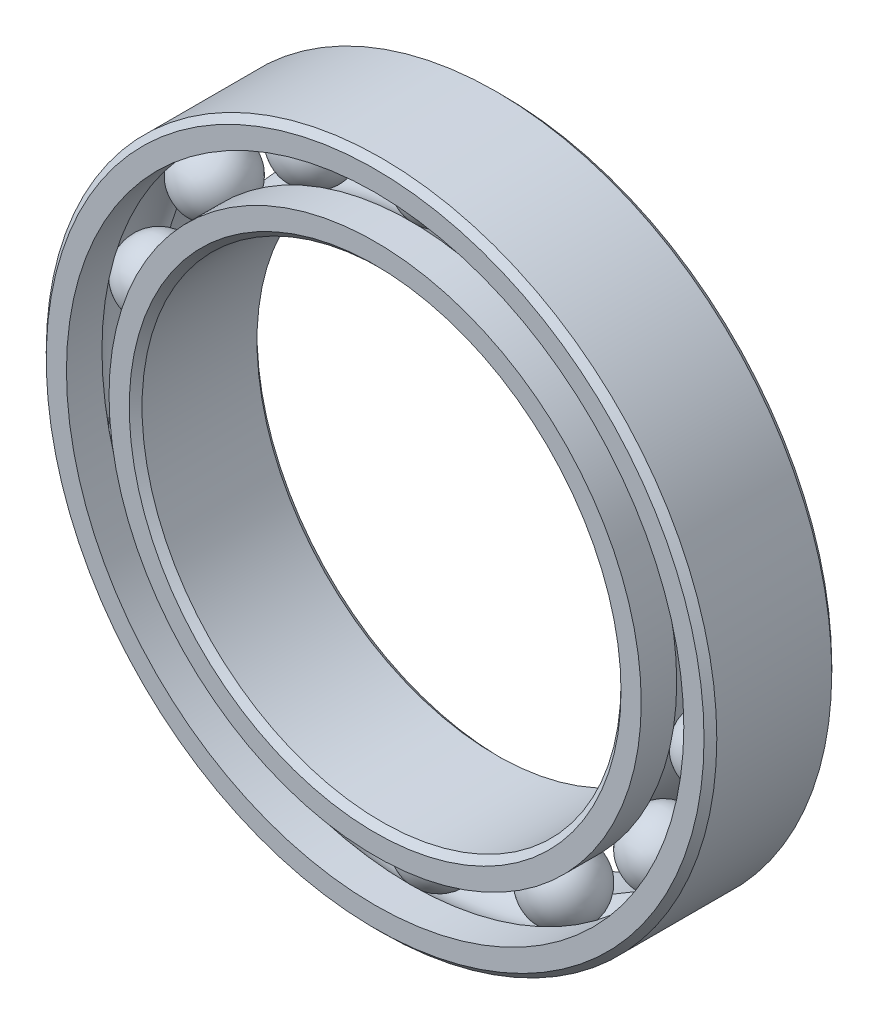
ISO-10303-21;
HEADER;
FILE_DESCRIPTION(('STEP AP214'),'2;1');
FILE_NAME('part.step','',(''),(''),'','','');
FILE_SCHEMA(('AUTOMOTIVE_DESIGN { 1 0 10303 214 1 1 1 1 }'));
ENDSEC;
DATA;
#1=APPLICATION_CONTEXT('core data for automotive mechanical design processes');
#2=APPLICATION_PROTOCOL_DEFINITION('international standard','automotive_design',2000,#1);
#3=PRODUCT_CONTEXT('',#1,'mechanical');
#4=PRODUCT('Part','Part','',(#3));
#5=PRODUCT_RELATED_PRODUCT_CATEGORY('part','',(#4));
#6=PRODUCT_DEFINITION_FORMATION('','',#4);
#7=PRODUCT_DEFINITION_CONTEXT('part definition',#1,'design');
#8=PRODUCT_DEFINITION('design','',#6,#7);
#9=PRODUCT_DEFINITION_SHAPE('','',#8);
#10=(LENGTH_UNIT() NAMED_UNIT(*) SI_UNIT(.MILLI.,.METRE.));
#11=(NAMED_UNIT(*) PLANE_ANGLE_UNIT() SI_UNIT($,.RADIAN.));
#12=(NAMED_UNIT(*) SI_UNIT($,.STERADIAN.) SOLID_ANGLE_UNIT());
#13=UNCERTAINTY_MEASURE_WITH_UNIT(LENGTH_MEASURE(1.E-05),#10,'distance_accuracy_value','');
#14=(GEOMETRIC_REPRESENTATION_CONTEXT(3) GLOBAL_UNCERTAINTY_ASSIGNED_CONTEXT((#13)) GLOBAL_UNIT_ASSIGNED_CONTEXT((#10,
#11,#12)) REPRESENTATION_CONTEXT('',''));
#15=CARTESIAN_POINT('',(0.,0.,0.));
#16=DIRECTION('',(0.,0.,1.));
#17=DIRECTION('',(1.,0.,0.));
#18=AXIS2_PLACEMENT_3D('',#15,#16,#17);
#19=CARTESIAN_POINT('',(3.90495365205792,8.10871981112182,0.));
#20=DIRECTION('',(0.,0.,1.));
#21=DIRECTION('',(0.433883739117546,0.900968867902425,0.));
#22=AXIS2_PLACEMENT_3D('',#19,#20,#21);
#23=SPHERICAL_SURFACE('',#22,1.11111111111111);
#24=CARTESIAN_POINT('',(3.90495365205792,8.10871981112182,1.11111111111111));
#25=VERTEX_POINT('',#24);
#26=VERTEX_LOOP('',#25);
#27=FACE_BOUND('',#26,.T.);
#28=ADVANCED_FACE('F37',(#27),#23,.T.);
#29=CLOSED_SHELL('',(#28));
#30=MANIFOLD_SOLID_BREP('B2',#29);
#31=CARTESIAN_POINT('',(7.0364833422122,5.61140821672869,0.));
#32=DIRECTION('',(0.,0.,1.));
#33=DIRECTION('',(0.781831482468022,0.623489801858743,0.));
#34=AXIS2_PLACEMENT_3D('',#31,#32,#33);
#35=SPHERICAL_SURFACE('',#34,1.11111111111111);
#36=CARTESIAN_POINT('',(7.0364833422122,5.61140821672869,1.11111111111111));
#37=VERTEX_POINT('',#36);
#38=VERTEX_LOOP('',#37);
#39=FACE_BOUND('',#38,.T.);
#40=ADVANCED_FACE('F57',(#39),#35,.T.);
#41=CLOSED_SHELL('',(#40));
#42=MANIFOLD_SOLID_BREP('B6',#41);
#43=CARTESIAN_POINT('',(8.77435120963639,2.00268840560692,0.));
#44=DIRECTION('',(0.,0.,1.));
#45=DIRECTION('',(0.974927912181821,0.222520933956325,0.));
#46=AXIS2_PLACEMENT_3D('',#43,#44,#45);
#47=SPHERICAL_SURFACE('',#46,1.11111111111111);
#48=CARTESIAN_POINT('',(8.77435120963639,2.00268840560692,1.11111111111111));
#49=VERTEX_POINT('',#48);
#50=VERTEX_LOOP('',#49);
#51=FACE_BOUND('',#50,.T.);
#52=ADVANCED_FACE('F77',(#51),#47,.T.);
#53=CLOSED_SHELL('',(#52));
#54=MANIFOLD_SOLID_BREP('B33',#53);
#55=CARTESIAN_POINT('',(8.77435120963643,-2.00268840560675,0.));
#56=DIRECTION('',(0.,0.,1.));
#57=DIRECTION('',(0.974927912181826,-0.222520933956305,0.));
#58=AXIS2_PLACEMENT_3D('',#55,#56,#57);
#59=SPHERICAL_SURFACE('',#58,1.11111111111111);
#60=CARTESIAN_POINT('',(8.77435120963643,-2.00268840560675,1.11111111111111));
#61=VERTEX_POINT('',#60);
#62=VERTEX_LOOP('',#61);
#63=FACE_BOUND('',#62,.T.);
#64=ADVANCED_FACE('F97',(#63),#59,.T.);
#65=CLOSED_SHELL('',(#64));
#66=MANIFOLD_SOLID_BREP('B53',#65);
#67=CARTESIAN_POINT('',(7.03648334221232,-5.61140821672854,0.));
#68=DIRECTION('',(0.,0.,1.));
#69=DIRECTION('',(0.781831482468035,-0.623489801858727,0.));
#70=AXIS2_PLACEMENT_3D('',#67,#68,#69);
#71=SPHERICAL_SURFACE('',#70,1.11111111111111);
#72=CARTESIAN_POINT('',(7.03648334221232,-5.61140821672854,1.11111111111111));
#73=VERTEX_POINT('',#72);
#74=VERTEX_LOOP('',#73);
#75=FACE_BOUND('',#74,.T.);
#76=ADVANCED_FACE('F117',(#75),#71,.T.);
#77=CLOSED_SHELL('',(#76));
#78=MANIFOLD_SOLID_BREP('B73',#77);
#79=CARTESIAN_POINT('',(3.90495365205809,-8.10871981112174,0.));
#80=DIRECTION('',(0.,0.,1.));
#81=DIRECTION('',(0.433883739117565,-0.900968867902416,0.));
#82=AXIS2_PLACEMENT_3D('',#79,#80,#81);
#83=SPHERICAL_SURFACE('',#82,1.11111111111111);
#84=CARTESIAN_POINT('',(3.90495365205809,-8.10871981112174,1.11111111111111));
#85=VERTEX_POINT('',#84);
#86=VERTEX_LOOP('',#85);
#87=FACE_BOUND('',#86,.T.);
#88=ADVANCED_FACE('F137',(#87),#83,.T.);
#89=CLOSED_SHELL('',(#88));
#90=MANIFOLD_SOLID_BREP('B93',#89);
#91=CARTESIAN_POINT('',(0.,-9.,0.));
#92=DIRECTION('',(0.,0.,1.));
#93=DIRECTION('',(0.,-1.,0.));
#94=AXIS2_PLACEMENT_3D('',#91,#92,#93);
#95=SPHERICAL_SURFACE('',#94,1.11111111111111);
#96=CARTESIAN_POINT('',(0.,-9.,1.11111111111111));
#97=VERTEX_POINT('',#96);
#98=VERTEX_LOOP('',#97);
#99=FACE_BOUND('',#98,.T.);
#100=ADVANCED_FACE('F157',(#99),#95,.T.);
#101=CLOSED_SHELL('',(#100));
#102=MANIFOLD_SOLID_BREP('B113',#101);
#103=CARTESIAN_POINT('',(-3.90495365205797,-8.1087198111218,0.));
#104=DIRECTION('',(0.,0.,1.));
#105=DIRECTION('',(-0.433883739117553,-0.900968867902422,0.));
#106=AXIS2_PLACEMENT_3D('',#103,#104,#105);
#107=SPHERICAL_SURFACE('',#106,1.11111111111111);
#108=CARTESIAN_POINT('',(-3.90495365205797,-8.1087198111218,1.11111111111111));
#109=VERTEX_POINT('',#108);
#110=VERTEX_LOOP('',#109);
#111=FACE_BOUND('',#110,.T.);
#112=ADVANCED_FACE('F177',(#111),#107,.T.);
#113=CLOSED_SHELL('',(#112));
#114=MANIFOLD_SOLID_BREP('B133',#113);
#115=CARTESIAN_POINT('',(-7.03648334221224,-5.61140821672864,0.));
#116=DIRECTION('',(0.,0.,1.));
#117=DIRECTION('',(-0.781831482468027,-0.623489801858737,0.));
#118=AXIS2_PLACEMENT_3D('',#115,#116,#117);
#119=SPHERICAL_SURFACE('',#118,1.11111111111111);
#120=CARTESIAN_POINT('',(-7.03648334221224,-5.61140821672864,1.11111111111111));
#121=VERTEX_POINT('',#120);
#122=VERTEX_LOOP('',#121);
#123=FACE_BOUND('',#122,.T.);
#124=ADVANCED_FACE('F197',(#123),#119,.T.);
#125=CLOSED_SHELL('',(#124));
#126=MANIFOLD_SOLID_BREP('B153',#125);
#127=CARTESIAN_POINT('',(-8.77435120963641,-2.00268840560686,0.));
#128=DIRECTION('',(0.,0.,1.));
#129=DIRECTION('',(-0.974927912181823,-0.222520933956318,0.));
#130=AXIS2_PLACEMENT_3D('',#127,#128,#129);
#131=SPHERICAL_SURFACE('',#130,1.11111111111111);
#132=CARTESIAN_POINT('',(-8.77435120963641,-2.00268840560686,1.11111111111111));
#133=VERTEX_POINT('',#132);
#134=VERTEX_LOOP('',#133);
#135=FACE_BOUND('',#134,.T.);
#136=ADVANCED_FACE('F217',(#135),#131,.T.);
#137=CLOSED_SHELL('',(#136));
#138=MANIFOLD_SOLID_BREP('B173',#137);
#139=CARTESIAN_POINT('',(-8.77435120963642,2.0026884056068,0.));
#140=DIRECTION('',(0.,0.,1.));
#141=DIRECTION('',(-0.974927912181824,0.222520933956311,0.));
#142=AXIS2_PLACEMENT_3D('',#139,#140,#141);
#143=SPHERICAL_SURFACE('',#142,1.11111111111111);
#144=CARTESIAN_POINT('',(-8.77435120963642,2.0026884056068,1.11111111111111));
#145=VERTEX_POINT('',#144);
#146=VERTEX_LOOP('',#145);
#147=FACE_BOUND('',#146,.T.);
#148=ADVANCED_FACE('F237',(#147),#143,.T.);
#149=CLOSED_SHELL('',(#148));
#150=MANIFOLD_SOLID_BREP('B193',#149);
#151=CARTESIAN_POINT('',(-7.03648334221228,5.61140821672859,0.));
#152=DIRECTION('',(0.,0.,1.));
#153=DIRECTION('',(-0.781831482468031,0.623489801858732,0.));
#154=AXIS2_PLACEMENT_3D('',#151,#152,#153);
#155=SPHERICAL_SURFACE('',#154,1.11111111111111);
#156=CARTESIAN_POINT('',(-7.03648334221228,5.61140821672859,1.11111111111111));
#157=VERTEX_POINT('',#156);
#158=VERTEX_LOOP('',#157);
#159=FACE_BOUND('',#158,.T.);
#160=ADVANCED_FACE('F257',(#159),#155,.T.);
#161=CLOSED_SHELL('',(#160));
#162=MANIFOLD_SOLID_BREP('B213',#161);
#163=CARTESIAN_POINT('',(-3.90495365205803,8.10871981112177,0.));
#164=DIRECTION('',(0.,0.,1.));
#165=DIRECTION('',(-0.433883739117559,0.900968867902419,0.));
#166=AXIS2_PLACEMENT_3D('',#163,#164,#165);
#167=SPHERICAL_SURFACE('',#166,1.11111111111111);
#168=CARTESIAN_POINT('',(-3.90495365205803,8.10871981112177,1.11111111111111));
#169=VERTEX_POINT('',#168);
#170=VERTEX_LOOP('',#169);
#171=FACE_BOUND('',#170,.T.);
#172=ADVANCED_FACE('F277',(#171),#167,.T.);
#173=CLOSED_SHELL('',(#172));
#174=MANIFOLD_SOLID_BREP('B233',#173);
#175=CARTESIAN_POINT('',(0.,9.,0.));
#176=DIRECTION('',(0.,0.,1.));
#177=DIRECTION('',(0.,1.,0.));
#178=AXIS2_PLACEMENT_3D('',#175,#176,#177);
#179=SPHERICAL_SURFACE('',#178,1.11111111111111);
#180=CARTESIAN_POINT('',(0.,9.,1.11111111111111));
#181=VERTEX_POINT('',#180);
#182=VERTEX_LOOP('',#181);
#183=FACE_BOUND('',#182,.T.);
#184=ADVANCED_FACE('F299',(#183),#179,.T.);
#185=CLOSED_SHELL('',(#184));
#186=MANIFOLD_SOLID_BREP('B253',#185);
#187=CARTESIAN_POINT('',(0.,8.33333333333333,2.));
#188=DIRECTION('',(0.,0.,-1.));
#189=DIRECTION('',(-1.,0.,0.));
#190=AXIS2_PLACEMENT_3D('',#187,#188,#189);
#191=PLANE('',#190);
#192=CARTESIAN_POINT('',(0.,0.,2.));
#193=DIRECTION('',(0.,0.,1.));
#194=DIRECTION('',(1.,0.,0.));
#195=AXIS2_PLACEMENT_3D('',#192,#193,#194);
#196=CIRCLE('',#195,7.7);
#197=CARTESIAN_POINT('',(7.7,0.,2.));
#198=VERTEX_POINT('',#197);
#199=EDGE_CURVE('E346',#198,#198,#196,.T.);
#200=ORIENTED_EDGE('',*,*,#199,.F.);
#201=EDGE_LOOP('',(#200));
#202=FACE_BOUND('',#201,.T.);
#203=CARTESIAN_POINT('',(0.,0.,2.));
#204=DIRECTION('',(0.,0.,1.));
#205=DIRECTION('',(1.,0.,0.));
#206=AXIS2_PLACEMENT_3D('',#203,#204,#205);
#207=CIRCLE('',#206,8.33333333333333);
#208=CARTESIAN_POINT('',(8.33333333333333,0.,2.));
#209=VERTEX_POINT('',#208);
#210=EDGE_CURVE('E298',#209,#209,#207,.T.);
#211=ORIENTED_EDGE('',*,*,#210,.T.);
#212=EDGE_LOOP('',(#211));
#213=FACE_BOUND('',#212,.T.);
#214=ADVANCED_FACE('F318',(#202,#213),#191,.F.);
#215=CARTESIAN_POINT('',(0.,0.,2.));
#216=DIRECTION('',(0.,0.,1.));
#217=DIRECTION('',(1.,0.,0.));
#218=AXIS2_PLACEMENT_3D('',#215,#216,#217);
#219=CYLINDRICAL_SURFACE('',#218,8.33333333333333);
#220=ORIENTED_EDGE('',*,*,#210,.F.);
#221=EDGE_LOOP('',(#220));
#222=FACE_BOUND('',#221,.T.);
#223=CARTESIAN_POINT('',(0.,0.,0.888888888888889));
#224=DIRECTION('',(0.,0.,1.));
#225=DIRECTION('',(1.,0.,0.));
#226=AXIS2_PLACEMENT_3D('',#223,#224,#225);
#227=CIRCLE('',#226,8.33333333333333);
#228=CARTESIAN_POINT('',(8.33333333333333,0.,0.888888888888889));
#229=VERTEX_POINT('',#228);
#230=EDGE_CURVE('E324',#229,#229,#227,.T.);
#231=ORIENTED_EDGE('',*,*,#230,.T.);
#232=EDGE_LOOP('',(#231));
#233=FACE_BOUND('',#232,.T.);
#234=ADVANCED_FACE('F353',(#222,#233),#219,.T.);
#235=CARTESIAN_POINT('',(0.,0.,0.));
#236=DIRECTION('',(0.,0.,1.));
#237=DIRECTION('',(1.,0.,0.));
#238=AXIS2_PLACEMENT_3D('',#235,#236,#237);
#239=TOROIDAL_SURFACE('',#238,9.,1.11111111111111);
#240=ORIENTED_EDGE('',*,*,#230,.F.);
#241=EDGE_LOOP('',(#240));
#242=FACE_BOUND('',#241,.T.);
#243=CARTESIAN_POINT('',(0.,0.,-0.888888888888889));
#244=DIRECTION('',(0.,0.,1.));
#245=DIRECTION('',(1.,0.,0.));
#246=AXIS2_PLACEMENT_3D('',#243,#244,#245);
#247=CIRCLE('',#246,8.33333333333333);
#248=CARTESIAN_POINT('',(8.33333333333333,0.,-0.888888888888889));
#249=VERTEX_POINT('',#248);
#250=EDGE_CURVE('E328',#249,#249,#247,.T.);
#251=ORIENTED_EDGE('',*,*,#250,.T.);
#252=EDGE_LOOP('',(#251));
#253=FACE_BOUND('',#252,.T.);
#254=ADVANCED_FACE('F357',(#242,#253),#239,.F.);
#255=CARTESIAN_POINT('',(0.,0.,2.));
#256=DIRECTION('',(0.,0.,1.));
#257=DIRECTION('',(1.,0.,0.));
#258=AXIS2_PLACEMENT_3D('',#255,#256,#257);
#259=CYLINDRICAL_SURFACE('',#258,8.33333333333333);
#260=ORIENTED_EDGE('',*,*,#250,.F.);
#261=EDGE_LOOP('',(#260));
#262=FACE_BOUND('',#261,.T.);
#263=CARTESIAN_POINT('',(0.,0.,-2.));
#264=DIRECTION('',(0.,0.,1.));
#265=DIRECTION('',(1.,0.,0.));
#266=AXIS2_PLACEMENT_3D('',#263,#264,#265);
#267=CIRCLE('',#266,8.33333333333333);
#268=CARTESIAN_POINT('',(8.33333333333333,0.,-2.));
#269=VERTEX_POINT('',#268);
#270=EDGE_CURVE('E332',#269,#269,#267,.T.);
#271=ORIENTED_EDGE('',*,*,#270,.T.);
#272=EDGE_LOOP('',(#271));
#273=FACE_BOUND('',#272,.T.);
#274=ADVANCED_FACE('F362',(#262,#273),#259,.T.);
#275=CARTESIAN_POINT('',(0.,7.7,-2.));
#276=DIRECTION('',(0.,0.,1.));
#277=DIRECTION('',(1.,0.,0.));
#278=AXIS2_PLACEMENT_3D('',#275,#276,#277);
#279=PLANE('',#278);
#280=ORIENTED_EDGE('',*,*,#270,.F.);
#281=EDGE_LOOP('',(#280));
#282=FACE_BOUND('',#281,.T.);
#283=CARTESIAN_POINT('',(0.,0.,-2.));
#284=DIRECTION('',(0.,0.,1.));
#285=DIRECTION('',(1.,0.,0.));
#286=AXIS2_PLACEMENT_3D('',#283,#284,#285);
#287=CIRCLE('',#286,7.7);
#288=CARTESIAN_POINT('',(7.7,0.,-2.));
#289=VERTEX_POINT('',#288);
#290=EDGE_CURVE('E337',#289,#289,#287,.T.);
#291=ORIENTED_EDGE('',*,*,#290,.T.);
#292=EDGE_LOOP('',(#291));
#293=FACE_BOUND('',#292,.T.);
#294=ADVANCED_FACE('F368',(#282,#293),#279,.F.);
#295=CARTESIAN_POINT('',(0.,0.,-1.8));
#296=DIRECTION('',(0.,0.,-1.));
#297=DIRECTION('',(-1.,0.,0.));
#298=AXIS2_PLACEMENT_3D('',#295,#296,#297);
#299=CONICAL_SURFACE('',#298,7.5,0.785398163397445);
#300=ORIENTED_EDGE('',*,*,#290,.F.);
#301=EDGE_LOOP('',(#300));
#302=FACE_BOUND('',#301,.T.);
#303=CARTESIAN_POINT('',(0.,0.,-1.8));
#304=DIRECTION('',(0.,0.,1.));
#305=DIRECTION('',(1.,0.,0.));
#306=AXIS2_PLACEMENT_3D('',#303,#304,#305);
#307=CIRCLE('',#306,7.5);
#308=CARTESIAN_POINT('',(7.5,0.,-1.8));
#309=VERTEX_POINT('',#308);
#310=EDGE_CURVE('E340',#309,#309,#307,.T.);
#311=ORIENTED_EDGE('',*,*,#310,.T.);
#312=EDGE_LOOP('',(#311));
#313=FACE_BOUND('',#312,.T.);
#314=ADVANCED_FACE('F372',(#302,#313),#299,.F.);
#315=CARTESIAN_POINT('',(0.,0.,2.));
#316=DIRECTION('',(0.,0.,1.));
#317=DIRECTION('',(1.,0.,0.));
#318=AXIS2_PLACEMENT_3D('',#315,#316,#317);
#319=CYLINDRICAL_SURFACE('',#318,7.5);
#320=ORIENTED_EDGE('',*,*,#310,.F.);
#321=EDGE_LOOP('',(#320));
#322=FACE_BOUND('',#321,.T.);
#323=CARTESIAN_POINT('',(0.,0.,1.8));
#324=DIRECTION('',(0.,0.,1.));
#325=DIRECTION('',(1.,0.,0.));
#326=AXIS2_PLACEMENT_3D('',#323,#324,#325);
#327=CIRCLE('',#326,7.5);
#328=CARTESIAN_POINT('',(7.5,0.,1.8));
#329=VERTEX_POINT('',#328);
#330=EDGE_CURVE('E343',#329,#329,#327,.T.);
#331=ORIENTED_EDGE('',*,*,#330,.T.);
#332=EDGE_LOOP('',(#331));
#333=FACE_BOUND('',#332,.T.);
#334=ADVANCED_FACE('F376',(#322,#333),#319,.F.);
#335=CARTESIAN_POINT('',(0.,0.,2.));
#336=DIRECTION('',(0.,0.,1.));
#337=DIRECTION('',(1.,0.,0.));
#338=AXIS2_PLACEMENT_3D('',#335,#336,#337);
#339=CONICAL_SURFACE('',#338,7.7,0.785398163397452);
#340=ORIENTED_EDGE('',*,*,#330,.F.);
#341=EDGE_LOOP('',(#340));
#342=FACE_BOUND('',#341,.T.);
#343=ORIENTED_EDGE('',*,*,#199,.T.);
#344=EDGE_LOOP('',(#343));
#345=FACE_BOUND('',#344,.T.);
#346=ADVANCED_FACE('F350',(#342,#345),#339,.F.);
#347=CLOSED_SHELL('',(#214,#234,#254,#274,#294,#314,#334,#346));
#348=MANIFOLD_SOLID_BREP('B273',#347);
#349=CARTESIAN_POINT('',(0.,0.,1.8));
#350=DIRECTION('',(0.,0.,-1.));
#351=DIRECTION('',(-1.,0.,0.));
#352=AXIS2_PLACEMENT_3D('',#349,#350,#351);
#353=CONICAL_SURFACE('',#352,10.5,0.785398163397442);
#354=CARTESIAN_POINT('',(0.,0.,2.));
#355=DIRECTION('',(0.,0.,1.));
#356=DIRECTION('',(1.,0.,0.));
#357=AXIS2_PLACEMENT_3D('',#354,#355,#356);
#358=CIRCLE('',#357,10.3);
#359=CARTESIAN_POINT('',(10.3,0.,2.));
#360=VERTEX_POINT('',#359);
#361=EDGE_CURVE('E467',#360,#360,#358,.T.);
#362=ORIENTED_EDGE('',*,*,#361,.F.);
#363=EDGE_LOOP('',(#362));
#364=FACE_BOUND('',#363,.T.);
#365=CARTESIAN_POINT('',(0.,0.,1.8));
#366=DIRECTION('',(0.,0.,1.));
#367=DIRECTION('',(1.,0.,0.));
#368=AXIS2_PLACEMENT_3D('',#365,#366,#367);
#369=CIRCLE('',#368,10.5);
#370=CARTESIAN_POINT('',(10.5,0.,1.8));
#371=VERTEX_POINT('',#370);
#372=EDGE_CURVE('E317',#371,#371,#369,.T.);
#373=ORIENTED_EDGE('',*,*,#372,.T.);
#374=EDGE_LOOP('',(#373));
#375=FACE_BOUND('',#374,.T.);
#376=ADVANCED_FACE('F439',(#364,#375),#353,.T.);
#377=CARTESIAN_POINT('',(0.,0.,2.));
#378=DIRECTION('',(0.,0.,1.));
#379=DIRECTION('',(1.,0.,0.));
#380=AXIS2_PLACEMENT_3D('',#377,#378,#379);
#381=CYLINDRICAL_SURFACE('',#380,10.5);
#382=ORIENTED_EDGE('',*,*,#372,.F.);
#383=EDGE_LOOP('',(#382));
#384=FACE_BOUND('',#383,.T.);
#385=CARTESIAN_POINT('',(0.,0.,-1.8));
#386=DIRECTION('',(0.,0.,1.));
#387=DIRECTION('',(1.,0.,0.));
#388=AXIS2_PLACEMENT_3D('',#385,#386,#387);
#389=CIRCLE('',#388,10.5);
#390=CARTESIAN_POINT('',(10.5,0.,-1.8));
#391=VERTEX_POINT('',#390);
#392=EDGE_CURVE('E445',#391,#391,#389,.T.);
#393=ORIENTED_EDGE('',*,*,#392,.T.);
#394=EDGE_LOOP('',(#393));
#395=FACE_BOUND('',#394,.T.);
#396=ADVANCED_FACE('F474',(#384,#395),#381,.T.);
#397=CARTESIAN_POINT('',(0.,0.,-2.));
#398=DIRECTION('',(0.,0.,1.));
#399=DIRECTION('',(1.,0.,0.));
#400=AXIS2_PLACEMENT_3D('',#397,#398,#399);
#401=CONICAL_SURFACE('',#400,10.3,0.785398163397443);
#402=ORIENTED_EDGE('',*,*,#392,.F.);
#403=EDGE_LOOP('',(#402));
#404=FACE_BOUND('',#403,.T.);
#405=CARTESIAN_POINT('',(0.,0.,-2.));
#406=DIRECTION('',(0.,0.,1.));
#407=DIRECTION('',(1.,0.,0.));
#408=AXIS2_PLACEMENT_3D('',#405,#406,#407);
#409=CIRCLE('',#408,10.3);
#410=CARTESIAN_POINT('',(10.3,0.,-2.));
#411=VERTEX_POINT('',#410);
#412=EDGE_CURVE('E449',#411,#411,#409,.T.);
#413=ORIENTED_EDGE('',*,*,#412,.T.);
#414=EDGE_LOOP('',(#413));
#415=FACE_BOUND('',#414,.T.);
#416=ADVANCED_FACE('F478',(#404,#415),#401,.T.);
#417=CARTESIAN_POINT('',(0.,10.3,-2.));
#418=DIRECTION('',(0.,0.,1.));
#419=DIRECTION('',(1.,0.,0.));
#420=AXIS2_PLACEMENT_3D('',#417,#418,#419);
#421=PLANE('',#420);
#422=ORIENTED_EDGE('',*,*,#412,.F.);
#423=EDGE_LOOP('',(#422));
#424=FACE_BOUND('',#423,.T.);
#425=CARTESIAN_POINT('',(0.,0.,-2.));
#426=DIRECTION('',(0.,0.,1.));
#427=DIRECTION('',(1.,0.,0.));
#428=AXIS2_PLACEMENT_3D('',#425,#426,#427);
#429=CIRCLE('',#428,9.66666666666667);
#430=CARTESIAN_POINT('',(9.66666666666667,0.,-2.));
#431=VERTEX_POINT('',#430);
#432=EDGE_CURVE('E453',#431,#431,#429,.T.);
#433=ORIENTED_EDGE('',*,*,#432,.T.);
#434=EDGE_LOOP('',(#433));
#435=FACE_BOUND('',#434,.T.);
#436=ADVANCED_FACE('F483',(#424,#435),#421,.F.);
#437=CARTESIAN_POINT('',(0.,0.,2.));
#438=DIRECTION('',(0.,0.,1.));
#439=DIRECTION('',(1.,0.,0.));
#440=AXIS2_PLACEMENT_3D('',#437,#438,#439);
#441=CYLINDRICAL_SURFACE('',#440,9.66666666666667);
#442=ORIENTED_EDGE('',*,*,#432,.F.);
#443=EDGE_LOOP('',(#442));
#444=FACE_BOUND('',#443,.T.);
#445=CARTESIAN_POINT('',(0.,0.,-0.88888888888889));
#446=DIRECTION('',(0.,0.,1.));
#447=DIRECTION('',(1.,0.,0.));
#448=AXIS2_PLACEMENT_3D('',#445,#446,#447);
#449=CIRCLE('',#448,9.66666666666667);
#450=CARTESIAN_POINT('',(9.66666666666667,0.,-0.88888888888889));
#451=VERTEX_POINT('',#450);
#452=EDGE_CURVE('E458',#451,#451,#449,.T.);
#453=ORIENTED_EDGE('',*,*,#452,.T.);
#454=EDGE_LOOP('',(#453));
#455=FACE_BOUND('',#454,.T.);
#456=ADVANCED_FACE('F489',(#444,#455),#441,.F.);
#457=CARTESIAN_POINT('',(0.,0.,0.));
#458=DIRECTION('',(0.,0.,1.));
#459=DIRECTION('',(1.,0.,0.));
#460=AXIS2_PLACEMENT_3D('',#457,#458,#459);
#461=TOROIDAL_SURFACE('',#460,9.,1.11111111111111);
#462=ORIENTED_EDGE('',*,*,#452,.F.);
#463=EDGE_LOOP('',(#462));
#464=FACE_BOUND('',#463,.T.);
#465=CARTESIAN_POINT('',(0.,0.,0.888888888888889));
#466=DIRECTION('',(0.,0.,1.));
#467=DIRECTION('',(1.,0.,0.));
#468=AXIS2_PLACEMENT_3D('',#465,#466,#467);
#469=CIRCLE('',#468,9.66666666666667);
#470=CARTESIAN_POINT('',(9.66666666666667,0.,0.888888888888889));
#471=VERTEX_POINT('',#470);
#472=EDGE_CURVE('E461',#471,#471,#469,.T.);
#473=ORIENTED_EDGE('',*,*,#472,.T.);
#474=EDGE_LOOP('',(#473));
#475=FACE_BOUND('',#474,.T.);
#476=ADVANCED_FACE('F493',(#464,#475),#461,.F.);
#477=CARTESIAN_POINT('',(0.,0.,2.));
#478=DIRECTION('',(0.,0.,1.));
#479=DIRECTION('',(1.,0.,0.));
#480=AXIS2_PLACEMENT_3D('',#477,#478,#479);
#481=CYLINDRICAL_SURFACE('',#480,9.66666666666667);
#482=ORIENTED_EDGE('',*,*,#472,.F.);
#483=EDGE_LOOP('',(#482));
#484=FACE_BOUND('',#483,.T.);
#485=CARTESIAN_POINT('',(0.,0.,2.));
#486=DIRECTION('',(0.,0.,1.));
#487=DIRECTION('',(1.,0.,0.));
#488=AXIS2_PLACEMENT_3D('',#485,#486,#487);
#489=CIRCLE('',#488,9.66666666666667);
#490=CARTESIAN_POINT('',(9.66666666666667,0.,2.));
#491=VERTEX_POINT('',#490);
#492=EDGE_CURVE('E464',#491,#491,#489,.T.);
#493=ORIENTED_EDGE('',*,*,#492,.T.);
#494=EDGE_LOOP('',(#493));
#495=FACE_BOUND('',#494,.T.);
#496=ADVANCED_FACE('F497',(#484,#495),#481,.F.);
#497=CARTESIAN_POINT('',(0.,10.3,2.));
#498=DIRECTION('',(0.,0.,-1.));
#499=DIRECTION('',(-1.,0.,0.));
#500=AXIS2_PLACEMENT_3D('',#497,#498,#499);
#501=PLANE('',#500);
#502=ORIENTED_EDGE('',*,*,#492,.F.);
#503=EDGE_LOOP('',(#502));
#504=FACE_BOUND('',#503,.T.);
#505=ORIENTED_EDGE('',*,*,#361,.T.);
#506=EDGE_LOOP('',(#505));
#507=FACE_BOUND('',#506,.T.);
#508=ADVANCED_FACE('F471',(#504,#507),#501,.F.);
#509=CLOSED_SHELL('',(#376,#396,#416,#436,#456,#476,#496,#508));
#510=MANIFOLD_SOLID_BREP('B293',#509);
#511=ADVANCED_BREP_SHAPE_REPRESENTATION('',(#18,#30,#42,#54,#66,#78,#90,#102,#114,#126,#138,
#150,#162,#174,#186,#348,#510),#14);
#512=SHAPE_DEFINITION_REPRESENTATION(#9,#511);
ENDSEC;
END-ISO-10303-21;
